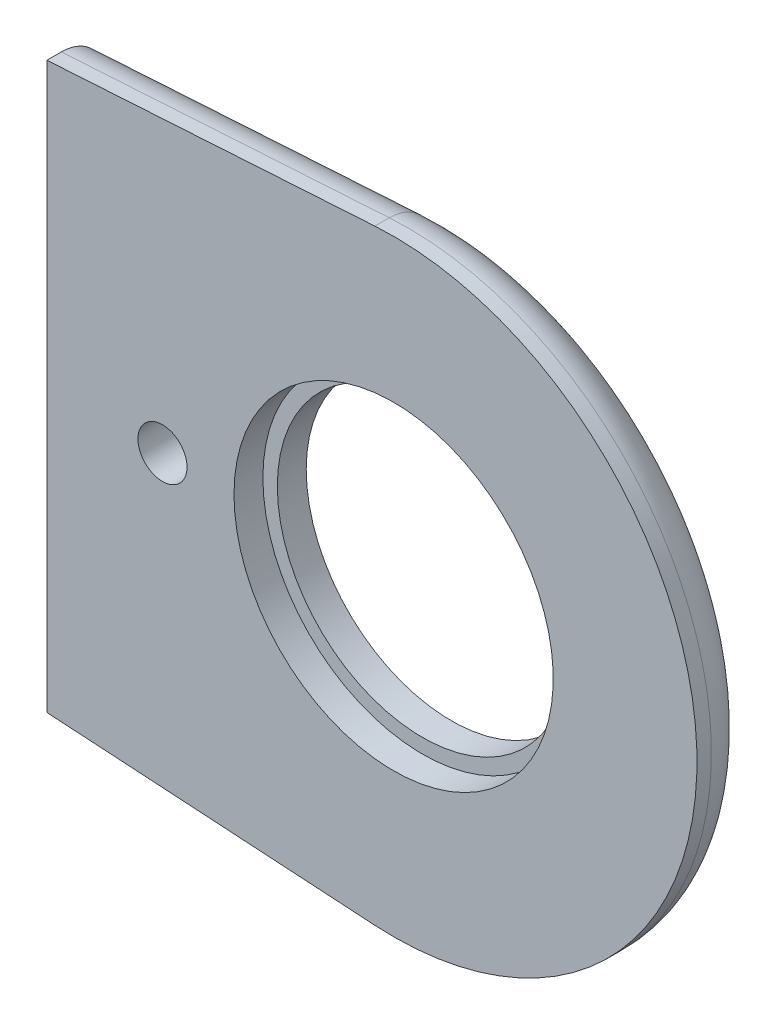
ISO-10303-21;
HEADER;
FILE_DESCRIPTION(('STEP AP214'),'2;1');
FILE_NAME('part.step','',(''),(''),'','','');
FILE_SCHEMA(('AUTOMOTIVE_DESIGN { 1 0 10303 214 1 1 1 1 }'));
ENDSEC;
DATA;
#1=APPLICATION_CONTEXT('core data for automotive mechanical design processes');
#2=APPLICATION_PROTOCOL_DEFINITION('international standard','automotive_design',2000,#1);
#3=PRODUCT_CONTEXT('',#1,'mechanical');
#4=PRODUCT('Part','Part','',(#3));
#5=PRODUCT_RELATED_PRODUCT_CATEGORY('part','',(#4));
#6=PRODUCT_DEFINITION_FORMATION('','',#4);
#7=PRODUCT_DEFINITION_CONTEXT('part definition',#1,'design');
#8=PRODUCT_DEFINITION('design','',#6,#7);
#9=PRODUCT_DEFINITION_SHAPE('','',#8);
#10=(LENGTH_UNIT() NAMED_UNIT(*) SI_UNIT(.MILLI.,.METRE.));
#11=(NAMED_UNIT(*) PLANE_ANGLE_UNIT() SI_UNIT($,.RADIAN.));
#12=(NAMED_UNIT(*) SI_UNIT($,.STERADIAN.) SOLID_ANGLE_UNIT());
#13=UNCERTAINTY_MEASURE_WITH_UNIT(LENGTH_MEASURE(1.E-05),#10,'distance_accuracy_value','');
#14=(GEOMETRIC_REPRESENTATION_CONTEXT(3) GLOBAL_UNCERTAINTY_ASSIGNED_CONTEXT((#13)) GLOBAL_UNIT_ASSIGNED_CONTEXT((#10,
#11,#12)) REPRESENTATION_CONTEXT('',''));
#15=CARTESIAN_POINT('',(0.,0.,0.));
#16=DIRECTION('',(0.,0.,1.));
#17=DIRECTION('',(1.,0.,0.));
#18=AXIS2_PLACEMENT_3D('',#15,#16,#17);
#19=CARTESIAN_POINT('',(141.,-21.01,4.00000000000001));
#20=DIRECTION('',(1.,0.,0.));
#21=DIRECTION('',(0.,0.,-1.));
#22=AXIS2_PLACEMENT_3D('',#19,#20,#21);
#23=PLANE('',#22);
#24=DIRECTION('',(0.,1.,0.));
#25=VECTOR('',#24,1.);
#26=CARTESIAN_POINT('',(141.,-21.01,4.00000000000001));
#27=LINE('',#26,#25);
#28=CARTESIAN_POINT('',(141.,-19.5523188608708,4.00000000000001));
#29=VERTEX_POINT('',#28);
#30=CARTESIAN_POINT('',(141.,19.5523188608708,4.00000000000001));
#31=VERTEX_POINT('',#30);
#32=EDGE_CURVE('E123',#29,#31,#27,.T.);
#33=ORIENTED_EDGE('',*,*,#32,.T.);
#34=DIRECTION('',(0.,0.,-1.));
#35=VECTOR('',#34,1.);
#36=CARTESIAN_POINT('',(141.,19.5523188608708,11.));
#37=LINE('',#36,#35);
#38=CARTESIAN_POINT('',(141.,19.5523188608708,3.));
#39=VERTEX_POINT('',#38);
#40=EDGE_CURVE('E119',#31,#39,#37,.T.);
#41=ORIENTED_EDGE('',*,*,#40,.T.);
#42=CARTESIAN_POINT('',(141.,16.5465583551797,3.));
#43=DIRECTION('',(1.,0.,0.));
#44=DIRECTION('',(0.,-1.,0.));
#45=AXIS2_PLACEMENT_3D('',#42,#43,#44);
#46=ELLIPSE('',#45,3.00576050569108,3.);
#47=CARTESIAN_POINT('',(141.,16.5465583551797,0.));
#48=VERTEX_POINT('',#47);
#49=EDGE_CURVE('E113',#39,#48,#46,.F.);
#50=ORIENTED_EDGE('',*,*,#49,.T.);
#51=DIRECTION('',(0.,1.,0.));
#52=VECTOR('',#51,1.);
#53=CARTESIAN_POINT('',(141.,0.,0.));
#54=LINE('',#53,#52);
#55=CARTESIAN_POINT('',(141.,-16.5465583551797,0.));
#56=VERTEX_POINT('',#55);
#57=EDGE_CURVE('E102',#56,#48,#54,.T.);
#58=ORIENTED_EDGE('',*,*,#57,.F.);
#59=CARTESIAN_POINT('',(141.,-16.5465583551797,3.));
#60=DIRECTION('',(1.,0.,0.));
#61=DIRECTION('',(0.,-1.,0.));
#62=AXIS2_PLACEMENT_3D('',#59,#60,#61);
#63=ELLIPSE('',#62,3.00576050569108,3.);
#64=CARTESIAN_POINT('',(141.,-19.5523188608708,3.));
#65=VERTEX_POINT('',#64);
#66=EDGE_CURVE('E118',#56,#65,#63,.F.);
#67=ORIENTED_EDGE('',*,*,#66,.T.);
#68=DIRECTION('',(0.,0.,-1.));
#69=VECTOR('',#68,1.);
#70=CARTESIAN_POINT('',(141.,-19.5523188608708,11.));
#71=LINE('',#70,#69);
#72=EDGE_CURVE('E135',#29,#65,#71,.T.);
#73=ORIENTED_EDGE('',*,*,#72,.F.);
#74=EDGE_LOOP('',(#33,#41,#50,#58,#67,#73));
#75=FACE_BOUND('',#74,.T.);
#76=ADVANCED_FACE('F42',(#75),#23,.F.);
#77=CARTESIAN_POINT('',(196.908753761415,-21.01,4.));
#78=DIRECTION('',(0.,0.,-1.));
#79=DIRECTION('',(-1.,0.,0.));
#80=AXIS2_PLACEMENT_3D('',#77,#78,#79);
#81=PLANE('',#80);
#82=CARTESIAN_POINT('',(165.,0.,4.));
#83=DIRECTION('',(0.,0.,-1.));
#84=DIRECTION('',(-1.,0.,0.));
#85=AXIS2_PLACEMENT_3D('',#82,#83,#84);
#86=CIRCLE('',#85,11.05);
#87=CARTESIAN_POINT('',(153.95,0.,4.00000000000001));
#88=VERTEX_POINT('',#87);
#89=EDGE_CURVE('E126',#88,#88,#86,.F.);
#90=ORIENTED_EDGE('',*,*,#89,.F.);
#91=EDGE_LOOP('',(#90));
#92=FACE_BOUND('',#91,.T.);
#93=CARTESIAN_POINT('',(165.,0.,4.));
#94=DIRECTION('',(0.,0.,-1.));
#95=DIRECTION('',(-1.,0.,0.));
#96=AXIS2_PLACEMENT_3D('',#93,#94,#95);
#97=CIRCLE('',#96,21.);
#98=CARTESIAN_POINT('',(163.700491181885,-20.9597537397661,4.00000000000001));
#99=VERTEX_POINT('',#98);
#100=CARTESIAN_POINT('',(163.700491181885,20.9597537397661,4.00000000000001));
#101=VERTEX_POINT('',#100);
#102=EDGE_CURVE('E115',#99,#101,#97,.F.);
#103=ORIENTED_EDGE('',*,*,#102,.T.);
#104=DIRECTION('',(-0.998083511417436,-0.0618813722911973,0.));
#105=VECTOR('',#104,1.);
#106=CARTESIAN_POINT('',(11.1242977306435,11.5,4.00000000000002));
#107=LINE('',#106,#105);
#108=EDGE_CURVE('E150',#101,#31,#107,.T.);
#109=ORIENTED_EDGE('',*,*,#108,.T.);
#110=ORIENTED_EDGE('',*,*,#32,.F.);
#111=DIRECTION('',(-0.998083511417436,0.0618813722911973,0.));
#112=VECTOR('',#111,1.);
#113=CARTESIAN_POINT('',(11.1242977306435,-11.5,4.00000000000002));
#114=LINE('',#113,#112);
#115=EDGE_CURVE('E112',#99,#29,#114,.T.);
#116=ORIENTED_EDGE('',*,*,#115,.F.);
#117=EDGE_LOOP('',(#103,#109,#110,#116));
#118=FACE_BOUND('',#117,.T.);
#119=CARTESIAN_POINT('',(149.,0.,4.));
#120=DIRECTION('',(0.,0.,-1.));
#121=DIRECTION('',(-1.,0.,0.));
#122=AXIS2_PLACEMENT_3D('',#119,#120,#121);
#123=CIRCLE('',#122,1.69999999999998);
#124=CARTESIAN_POINT('',(147.3,0.,4.));
#125=VERTEX_POINT('',#124);
#126=EDGE_CURVE('E175',#125,#125,#123,.T.);
#127=ORIENTED_EDGE('',*,*,#126,.T.);
#128=EDGE_LOOP('',(#127));
#129=FACE_BOUND('',#128,.T.);
#130=ADVANCED_FACE('F149',(#92,#118,#129),#81,.F.);
#131=CARTESIAN_POINT('',(165.,0.,11.));
#132=DIRECTION('',(0.,0.,-1.));
#133=DIRECTION('',(-1.,0.,0.));
#134=AXIS2_PLACEMENT_3D('',#131,#132,#133);
#135=CYLINDRICAL_SURFACE('',#134,10.05);
#136=CARTESIAN_POINT('',(165.,0.,0.));
#137=DIRECTION('',(0.,0.,-1.));
#138=DIRECTION('',(-1.,0.,0.));
#139=AXIS2_PLACEMENT_3D('',#136,#137,#138);
#140=CIRCLE('',#139,10.05);
#141=CARTESIAN_POINT('',(154.95,0.,0.));
#142=VERTEX_POINT('',#141);
#143=EDGE_CURVE('E167',#142,#142,#140,.T.);
#144=ORIENTED_EDGE('',*,*,#143,.T.);
#145=EDGE_LOOP('',(#144));
#146=FACE_BOUND('',#145,.T.);
#147=CARTESIAN_POINT('',(165.,0.,2.));
#148=DIRECTION('',(0.,0.,-1.));
#149=DIRECTION('',(-1.,0.,0.));
#150=AXIS2_PLACEMENT_3D('',#147,#148,#149);
#151=CIRCLE('',#150,10.05);
#152=CARTESIAN_POINT('',(154.95,0.,2.));
#153=VERTEX_POINT('',#152);
#154=EDGE_CURVE('E161',#153,#153,#151,.T.);
#155=ORIENTED_EDGE('',*,*,#154,.F.);
#156=EDGE_LOOP('',(#155));
#157=FACE_BOUND('',#156,.T.);
#158=ADVANCED_FACE('F199',(#146,#157),#135,.F.);
#159=CARTESIAN_POINT('',(149.,0.,0.));
#160=DIRECTION('',(0.,0.,-1.));
#161=DIRECTION('',(-1.,0.,0.));
#162=AXIS2_PLACEMENT_3D('',#159,#160,#161);
#163=CONICAL_SURFACE('',#162,3.14999999999999,0.785398163397448);
#164=CARTESIAN_POINT('',(149.,0.,1.45000000000001));
#165=DIRECTION('',(0.,0.,-1.));
#166=DIRECTION('',(-1.,0.,0.));
#167=AXIS2_PLACEMENT_3D('',#164,#165,#166);
#168=CIRCLE('',#167,1.69999999999998);
#169=CARTESIAN_POINT('',(147.3,0.,1.45000000000001));
#170=VERTEX_POINT('',#169);
#171=EDGE_CURVE('E52',#170,#170,#168,.T.);
#172=ORIENTED_EDGE('',*,*,#171,.F.);
#173=EDGE_LOOP('',(#172));
#174=FACE_BOUND('',#173,.T.);
#175=CARTESIAN_POINT('',(149.,0.,0.));
#176=DIRECTION('',(0.,0.,-1.));
#177=DIRECTION('',(-1.,0.,0.));
#178=AXIS2_PLACEMENT_3D('',#175,#176,#177);
#179=CIRCLE('',#178,3.14999999999999);
#180=CARTESIAN_POINT('',(145.85,0.,0.));
#181=VERTEX_POINT('',#180);
#182=EDGE_CURVE('E11',#181,#181,#179,.T.);
#183=ORIENTED_EDGE('',*,*,#182,.T.);
#184=EDGE_LOOP('',(#183));
#185=FACE_BOUND('',#184,.T.);
#186=ADVANCED_FACE('F187',(#174,#185),#163,.F.);
#187=CARTESIAN_POINT('',(149.,0.,0.));
#188=DIRECTION('',(0.,0.,-1.));
#189=DIRECTION('',(-1.,0.,0.));
#190=AXIS2_PLACEMENT_3D('',#187,#188,#189);
#191=CYLINDRICAL_SURFACE('',#190,1.69999999999998);
#192=ORIENTED_EDGE('',*,*,#126,.F.);
#193=EDGE_LOOP('',(#192));
#194=FACE_BOUND('',#193,.T.);
#195=ORIENTED_EDGE('',*,*,#171,.T.);
#196=EDGE_LOOP('',(#195));
#197=FACE_BOUND('',#196,.T.);
#198=ADVANCED_FACE('F181',(#194,#197),#191,.F.);
#199=CARTESIAN_POINT('',(165.,0.,11.));
#200=DIRECTION('',(0.,0.,-1.));
#201=DIRECTION('',(-1.,0.,0.));
#202=AXIS2_PLACEMENT_3D('',#199,#200,#201);
#203=CYLINDRICAL_SURFACE('',#202,21.);
#204=DIRECTION('',(0.,0.,-1.));
#205=VECTOR('',#204,1.);
#206=CARTESIAN_POINT('',(163.700491181885,20.9597537397661,11.));
#207=LINE('',#206,#205);
#208=CARTESIAN_POINT('',(163.700491181885,20.9597537397661,3.));
#209=VERTEX_POINT('',#208);
#210=EDGE_CURVE('E69',#101,#209,#207,.T.);
#211=ORIENTED_EDGE('',*,*,#210,.F.);
#212=ORIENTED_EDGE('',*,*,#102,.F.);
#213=DIRECTION('',(0.,0.,-1.));
#214=VECTOR('',#213,1.);
#215=CARTESIAN_POINT('',(163.700491181885,-20.9597537397661,11.));
#216=LINE('',#215,#214);
#217=CARTESIAN_POINT('',(163.700491181885,-20.9597537397661,3.));
#218=VERTEX_POINT('',#217);
#219=EDGE_CURVE('E62',#99,#218,#216,.T.);
#220=ORIENTED_EDGE('',*,*,#219,.T.);
#221=CARTESIAN_POINT('',(165.,0.,3.));
#222=DIRECTION('',(0.,0.,1.));
#223=DIRECTION('',(1.,0.,0.));
#224=AXIS2_PLACEMENT_3D('',#221,#222,#223);
#225=CIRCLE('',#224,21.);
#226=EDGE_CURVE('E137',#218,#209,#225,.T.);
#227=ORIENTED_EDGE('',*,*,#226,.T.);
#228=EDGE_LOOP('',(#211,#212,#220,#227));
#229=FACE_BOUND('',#228,.T.);
#230=ADVANCED_FACE('F177',(#229),#203,.T.);
#231=CARTESIAN_POINT('',(11.1242977306435,-11.5,11.));
#232=DIRECTION('',(0.0618813722911973,0.998083511417436,0.));
#233=DIRECTION('',(-0.998083511417436,0.0618813722911973,0.));
#234=AXIS2_PLACEMENT_3D('',#231,#232,#233);
#235=PLANE('',#234);
#236=ORIENTED_EDGE('',*,*,#219,.F.);
#237=ORIENTED_EDGE('',*,*,#115,.T.);
#238=ORIENTED_EDGE('',*,*,#72,.T.);
#239=DIRECTION('',(0.998083511417436,-0.0618813722911973,0.));
#240=VECTOR('',#239,1.);
#241=CARTESIAN_POINT('',(11.1242977306435,-11.5,3.));
#242=LINE('',#241,#240);
#243=EDGE_CURVE('E48',#65,#218,#242,.T.);
#244=ORIENTED_EDGE('',*,*,#243,.T.);
#245=EDGE_LOOP('',(#236,#237,#238,#244));
#246=FACE_BOUND('',#245,.T.);
#247=ADVANCED_FACE('F178',(#246),#235,.F.);
#248=CARTESIAN_POINT('',(0.,0.,0.));
#249=DIRECTION('',(0.,0.,1.));
#250=DIRECTION('',(1.,0.,0.));
#251=AXIS2_PLACEMENT_3D('',#248,#249,#250);
#252=PLANE('',#251);
#253=ORIENTED_EDGE('',*,*,#182,.F.);
#254=EDGE_LOOP('',(#253));
#255=FACE_BOUND('',#254,.T.);
#256=DIRECTION('',(0.998083511417436,-0.0618813722911973,0.));
#257=VECTOR('',#256,1.);
#258=CARTESIAN_POINT('',(-0.48202950219566,-7.77464494313874,0.));
#259=LINE('',#258,#257);
#260=CARTESIAN_POINT('',(163.886135298758,-17.9655032055138,0.));
#261=VERTEX_POINT('',#260);
#262=EDGE_CURVE('E110',#261,#56,#259,.F.);
#263=ORIENTED_EDGE('',*,*,#262,.T.);
#264=ORIENTED_EDGE('',*,*,#57,.T.);
#265=DIRECTION('',(0.998083511417436,0.0618813722911973,0.));
#266=VECTOR('',#265,1.);
#267=CARTESIAN_POINT('',(163.886135298759,17.9655032055138,0.));
#268=LINE('',#267,#266);
#269=CARTESIAN_POINT('',(163.886135298758,17.9655032055138,0.));
#270=VERTEX_POINT('',#269);
#271=EDGE_CURVE('E103',#48,#270,#268,.T.);
#272=ORIENTED_EDGE('',*,*,#271,.T.);
#273=CARTESIAN_POINT('',(165.,0.,0.));
#274=DIRECTION('',(0.,0.,1.));
#275=DIRECTION('',(1.,0.,0.));
#276=AXIS2_PLACEMENT_3D('',#273,#274,#275);
#277=CIRCLE('',#276,18.);
#278=EDGE_CURVE('E130',#270,#261,#277,.F.);
#279=ORIENTED_EDGE('',*,*,#278,.T.);
#280=EDGE_LOOP('',(#263,#264,#272,#279));
#281=FACE_BOUND('',#280,.T.);
#282=ORIENTED_EDGE('',*,*,#143,.F.);
#283=EDGE_LOOP('',(#282));
#284=FACE_BOUND('',#283,.T.);
#285=ADVANCED_FACE('F46',(#255,#281,#284),#252,.F.);
#286=CARTESIAN_POINT('',(165.,0.,3.));
#287=DIRECTION('',(0.,0.,1.));
#288=DIRECTION('',(1.,0.,0.));
#289=AXIS2_PLACEMENT_3D('',#286,#287,#288);
#290=TOROIDAL_SURFACE('',#289,18.,3.);
#291=CARTESIAN_POINT('',(163.886135298758,17.9655032055138,3.));
#292=DIRECTION('',(-0.998083511417436,-0.061881372291193,0.));
#293=DIRECTION('',(0.061881372291193,-0.998083511417436,0.));
#294=AXIS2_PLACEMENT_3D('',#291,#292,#293);
#295=CIRCLE('',#294,3.);
#296=EDGE_CURVE('E128',#209,#270,#295,.T.);
#297=ORIENTED_EDGE('',*,*,#296,.F.);
#298=ORIENTED_EDGE('',*,*,#226,.F.);
#299=CARTESIAN_POINT('',(163.886135298758,-17.9655032055138,3.));
#300=DIRECTION('',(-0.998083511417436,0.061881372291193,0.));
#301=DIRECTION('',(-0.061881372291193,-0.998083511417436,0.));
#302=AXIS2_PLACEMENT_3D('',#299,#300,#301);
#303=CIRCLE('',#302,3.);
#304=EDGE_CURVE('E156',#261,#218,#303,.T.);
#305=ORIENTED_EDGE('',*,*,#304,.F.);
#306=ORIENTED_EDGE('',*,*,#278,.F.);
#307=EDGE_LOOP('',(#297,#298,#305,#306));
#308=FACE_BOUND('',#307,.T.);
#309=ADVANCED_FACE('F206',(#308),#290,.T.);
#310=CARTESIAN_POINT('',(11.1242977306435,11.5,11.));
#311=DIRECTION('',(-0.0618813722911973,0.998083511417436,0.));
#312=DIRECTION('',(-0.998083511417436,-0.0618813722911973,0.));
#313=AXIS2_PLACEMENT_3D('',#310,#311,#312);
#314=PLANE('',#313);
#315=ORIENTED_EDGE('',*,*,#108,.F.);
#316=ORIENTED_EDGE('',*,*,#210,.T.);
#317=DIRECTION('',(0.998083511417436,0.0618813722911973,0.));
#318=VECTOR('',#317,1.);
#319=CARTESIAN_POINT('',(11.1242977306435,11.5,3.));
#320=LINE('',#319,#318);
#321=EDGE_CURVE('E140',#209,#39,#320,.F.);
#322=ORIENTED_EDGE('',*,*,#321,.T.);
#323=ORIENTED_EDGE('',*,*,#40,.F.);
#324=EDGE_LOOP('',(#315,#316,#322,#323));
#325=FACE_BOUND('',#324,.T.);
#326=ADVANCED_FACE('F213',(#325),#314,.T.);
#327=CARTESIAN_POINT('',(-0.48202950219566,7.77464494313875,3.));
#328=DIRECTION('',(-0.998083511417436,-0.0618813722911973,0.));
#329=DIRECTION('',(0.0618813722911973,-0.998083511417436,0.));
#330=AXIS2_PLACEMENT_3D('',#327,#328,#329);
#331=CYLINDRICAL_SURFACE('',#330,3.);
#332=ORIENTED_EDGE('',*,*,#49,.F.);
#333=ORIENTED_EDGE('',*,*,#321,.F.);
#334=ORIENTED_EDGE('',*,*,#296,.T.);
#335=ORIENTED_EDGE('',*,*,#271,.F.);
#336=EDGE_LOOP('',(#332,#333,#334,#335));
#337=FACE_BOUND('',#336,.T.);
#338=ADVANCED_FACE('F125',(#337),#331,.T.);
#339=CARTESIAN_POINT('',(11.3099418475171,-8.50574946574769,3.));
#340=DIRECTION('',(0.998083511417436,-0.0618813722911973,0.));
#341=DIRECTION('',(0.0618813722911973,0.998083511417436,0.));
#342=AXIS2_PLACEMENT_3D('',#339,#340,#341);
#343=CYLINDRICAL_SURFACE('',#342,3.);
#344=ORIENTED_EDGE('',*,*,#66,.F.);
#345=ORIENTED_EDGE('',*,*,#262,.F.);
#346=ORIENTED_EDGE('',*,*,#304,.T.);
#347=ORIENTED_EDGE('',*,*,#243,.F.);
#348=EDGE_LOOP('',(#344,#345,#346,#347));
#349=FACE_BOUND('',#348,.T.);
#350=ADVANCED_FACE('F157',(#349),#343,.T.);
#351=CARTESIAN_POINT('',(165.,0.,2.));
#352=DIRECTION('',(0.,0.,-1.));
#353=DIRECTION('',(-1.,0.,0.));
#354=AXIS2_PLACEMENT_3D('',#351,#352,#353);
#355=PLANE('',#354);
#356=ORIENTED_EDGE('',*,*,#154,.T.);
#357=EDGE_LOOP('',(#356));
#358=FACE_BOUND('',#357,.T.);
#359=CARTESIAN_POINT('',(165.,0.,2.));
#360=DIRECTION('',(0.,0.,-1.));
#361=DIRECTION('',(-1.,0.,0.));
#362=AXIS2_PLACEMENT_3D('',#359,#360,#361);
#363=CIRCLE('',#362,11.05);
#364=CARTESIAN_POINT('',(153.95,0.,2.));
#365=VERTEX_POINT('',#364);
#366=EDGE_CURVE('E141',#365,#365,#363,.T.);
#367=ORIENTED_EDGE('',*,*,#366,.F.);
#368=EDGE_LOOP('',(#367));
#369=FACE_BOUND('',#368,.T.);
#370=ADVANCED_FACE('F203',(#358,#369),#355,.F.);
#371=CARTESIAN_POINT('',(165.,0.,42.2541197284454));
#372=DIRECTION('',(0.,0.,-1.));
#373=DIRECTION('',(-1.,0.,0.));
#374=AXIS2_PLACEMENT_3D('',#371,#372,#373);
#375=CYLINDRICAL_SURFACE('',#374,11.05);
#376=ORIENTED_EDGE('',*,*,#89,.T.);
#377=EDGE_LOOP('',(#376));
#378=FACE_BOUND('',#377,.T.);
#379=ORIENTED_EDGE('',*,*,#366,.T.);
#380=EDGE_LOOP('',(#379));
#381=FACE_BOUND('',#380,.T.);
#382=ADVANCED_FACE('F198',(#378,#381),#375,.F.);
#383=CLOSED_SHELL('',(#76,#130,#158,#186,#198,#230,#247,#285,#309,#326,#338,#350,#370,#382));
#384=MANIFOLD_SOLID_BREP('B2',#383);
#385=ADVANCED_BREP_SHAPE_REPRESENTATION('',(#18,#384),#14);
#386=SHAPE_DEFINITION_REPRESENTATION(#9,#385);
ENDSEC;
END-ISO-10303-21;
